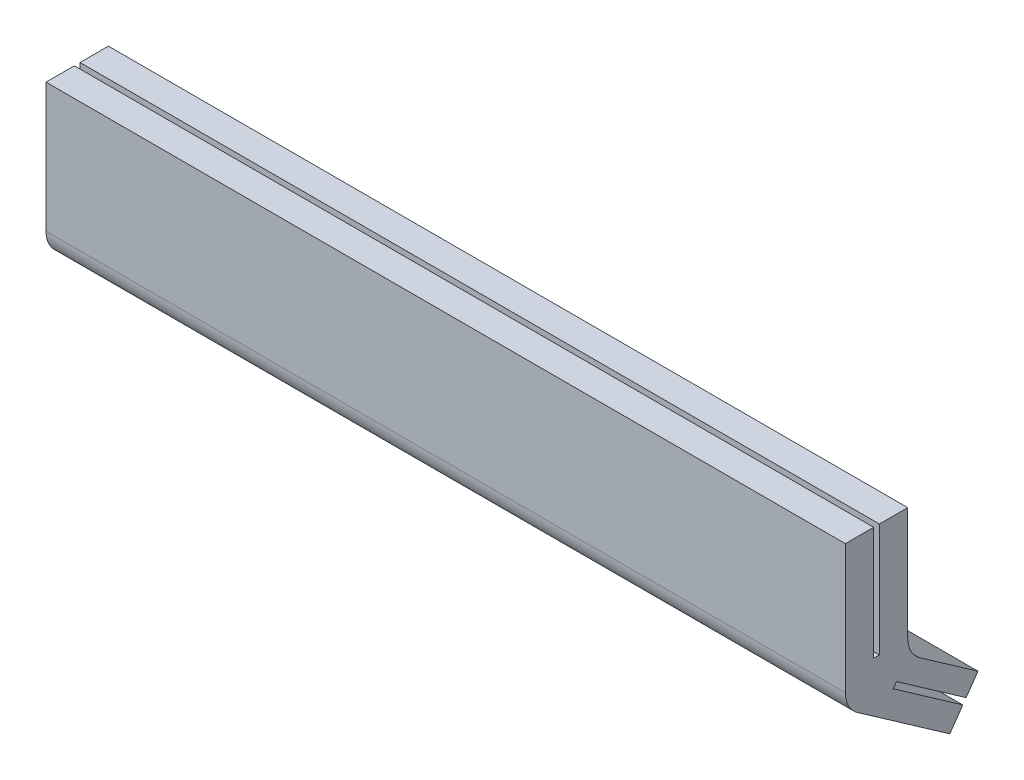
ISO-10303-21;
HEADER;
FILE_DESCRIPTION(('STEP AP214'),'2;1');
FILE_NAME('part.step','',(''),(''),'','','');
FILE_SCHEMA(('AUTOMOTIVE_DESIGN { 1 0 10303 214 1 1 1 1 }'));
ENDSEC;
DATA;
#1=APPLICATION_CONTEXT('core data for automotive mechanical design processes');
#2=APPLICATION_PROTOCOL_DEFINITION('international standard','automotive_design',2000,#1);
#3=PRODUCT_CONTEXT('',#1,'mechanical');
#4=PRODUCT('Part','Part','',(#3));
#5=PRODUCT_RELATED_PRODUCT_CATEGORY('part','',(#4));
#6=PRODUCT_DEFINITION_FORMATION('','',#4);
#7=PRODUCT_DEFINITION_CONTEXT('part definition',#1,'design');
#8=PRODUCT_DEFINITION('design','',#6,#7);
#9=PRODUCT_DEFINITION_SHAPE('','',#8);
#10=(LENGTH_UNIT() NAMED_UNIT(*) SI_UNIT(.MILLI.,.METRE.));
#11=(NAMED_UNIT(*) PLANE_ANGLE_UNIT() SI_UNIT($,.RADIAN.));
#12=(NAMED_UNIT(*) SI_UNIT($,.STERADIAN.) SOLID_ANGLE_UNIT());
#13=UNCERTAINTY_MEASURE_WITH_UNIT(LENGTH_MEASURE(1.E-05),#10,'distance_accuracy_value','');
#14=(GEOMETRIC_REPRESENTATION_CONTEXT(3) GLOBAL_UNCERTAINTY_ASSIGNED_CONTEXT((#13)) GLOBAL_UNIT_ASSIGNED_CONTEXT((#10,
#11,#12)) REPRESENTATION_CONTEXT('',''));
#15=CARTESIAN_POINT('',(0.,0.,0.));
#16=DIRECTION('',(0.,0.,1.));
#17=DIRECTION('',(1.,0.,0.));
#18=AXIS2_PLACEMENT_3D('',#15,#16,#17);
#19=CARTESIAN_POINT('',(280.71879766734,-285.,-12.0000000000006));
#20=DIRECTION('',(0.,-1.,0.));
#21=DIRECTION('',(0.,0.,-1.));
#22=AXIS2_PLACEMENT_3D('',#19,#20,#21);
#23=PLANE('',#22);
#24=DIRECTION('',(1.,0.,0.));
#25=VECTOR('',#24,1.);
#26=CARTESIAN_POINT('',(280.71879766734,-285.,-3.53883589099269E-13));
#27=LINE('',#26,#25);
#28=CARTESIAN_POINT('',(-141.,-285.,-4.037174620759E-13));
#29=VERTEX_POINT('',#28);
#30=CARTESIAN_POINT('',(141.,-285.,-3.53883593082689E-13));
#31=VERTEX_POINT('',#30);
#32=EDGE_CURVE('E159',#29,#31,#27,.T.);
#33=ORIENTED_EDGE('',*,*,#32,.F.);
#34=DIRECTION('',(0.,0.,1.));
#35=VECTOR('',#34,1.);
#36=CARTESIAN_POINT('',(-141.,-285.,-12.0000000000006));
#37=LINE('',#36,#35);
#38=CARTESIAN_POINT('',(-141.,-285.,9.99999999999945));
#39=VERTEX_POINT('',#38);
#40=EDGE_CURVE('E107',#29,#39,#37,.T.);
#41=ORIENTED_EDGE('',*,*,#40,.T.);
#42=DIRECTION('',(-1.,0.,0.));
#43=VECTOR('',#42,1.);
#44=CARTESIAN_POINT('',(280.71879766734,-285.,9.99999999999945));
#45=LINE('',#44,#43);
#46=CARTESIAN_POINT('',(141.,-285.,9.99999999999945));
#47=VERTEX_POINT('',#46);
#48=EDGE_CURVE('E255',#47,#39,#45,.T.);
#49=ORIENTED_EDGE('',*,*,#48,.F.);
#50=DIRECTION('',(0.,0.,1.));
#51=VECTOR('',#50,1.);
#52=CARTESIAN_POINT('',(141.,-285.,-12.0000000000006));
#53=LINE('',#52,#51);
#54=EDGE_CURVE('E221',#31,#47,#53,.T.);
#55=ORIENTED_EDGE('',*,*,#54,.F.);
#56=EDGE_LOOP('',(#33,#41,#49,#55));
#57=FACE_BOUND('',#56,.T.);
#58=ADVANCED_FACE('F32',(#57),#23,.F.);
#59=CARTESIAN_POINT('',(141.,-200.,0.));
#60=DIRECTION('',(1.,0.,0.));
#61=DIRECTION('',(0.,0.,-1.));
#62=AXIS2_PLACEMENT_3D('',#59,#60,#61);
#63=PLANE('',#62);
#64=DIRECTION('',(0.,1.,0.));
#65=VECTOR('',#64,1.);
#66=CARTESIAN_POINT('',(141.,-200.,-2.00000000000003));
#67=LINE('',#66,#65);
#68=CARTESIAN_POINT('',(141.,-325.,-2.00000000000056));
#69=VERTEX_POINT('',#68);
#70=CARTESIAN_POINT('',(141.,-285.,-2.00000000000036));
#71=VERTEX_POINT('',#70);
#72=EDGE_CURVE('E174',#69,#71,#67,.T.);
#73=ORIENTED_EDGE('',*,*,#72,.F.);
#74=DIRECTION('',(0.,0.,-1.));
#75=VECTOR('',#74,1.);
#76=CARTESIAN_POINT('',(141.,-325.,-4.73106403960405E-13));
#77=LINE('',#76,#75);
#78=CARTESIAN_POINT('',(141.,-325.,-5.55111513738092E-13));
#79=VERTEX_POINT('',#78);
#80=EDGE_CURVE('E162',#79,#69,#77,.T.);
#81=ORIENTED_EDGE('',*,*,#80,.F.);
#82=DIRECTION('',(0.,1.,0.));
#83=VECTOR('',#82,1.);
#84=CARTESIAN_POINT('',(141.,-200.,0.));
#85=LINE('',#84,#83);
#86=EDGE_CURVE('E157',#79,#31,#85,.T.);
#87=ORIENTED_EDGE('',*,*,#86,.T.);
#88=ORIENTED_EDGE('',*,*,#54,.T.);
#89=DIRECTION('',(0.,-1.,0.));
#90=VECTOR('',#89,1.);
#91=CARTESIAN_POINT('',(141.,-285.,9.99999999999945));
#92=LINE('',#91,#90);
#93=CARTESIAN_POINT('',(141.,-330.53179391148,9.99999999999946));
#94=VERTEX_POINT('',#93);
#95=EDGE_CURVE('E227',#47,#94,#92,.T.);
#96=ORIENTED_EDGE('',*,*,#95,.T.);
#97=CARTESIAN_POINT('',(141.,-330.53179391148,-5.51642065360625E-13));
#98=DIRECTION('',(1.,0.,0.));
#99=DIRECTION('',(0.,1.,0.));
#100=AXIS2_PLACEMENT_3D('',#97,#98,#99);
#101=CIRCLE('',#100,10.);
#102=CARTESIAN_POINT('',(141.,-338.72331435437,5.73576436350982));
#103=VERTEX_POINT('',#102);
#104=EDGE_CURVE('E230',#103,#94,#101,.F.);
#105=ORIENTED_EDGE('',*,*,#104,.F.);
#106=DIRECTION('',(0.,-0.57357643635104,-0.819152044288996));
#107=VECTOR('',#106,1.);
#108=CARTESIAN_POINT('',(141.,-338.72331435437,5.73576436350982));
#109=LINE('',#108,#107);
#110=CARTESIAN_POINT('',(141.,-361.548404052795,-26.8618419930054));
#111=VERTEX_POINT('',#110);
#112=EDGE_CURVE('E229',#103,#111,#109,.T.);
#113=ORIENTED_EDGE('',*,*,#112,.T.);
#114=DIRECTION('',(0.,0.819152044288982,-0.57357643635106));
#115=VECTOR('',#114,1.);
#116=CARTESIAN_POINT('',(141.,-361.548404052795,-26.8618419930054));
#117=LINE('',#116,#115);
#118=CARTESIAN_POINT('',(141.,-354.995187698483,-31.4504534838139));
#119=VERTEX_POINT('',#118);
#120=EDGE_CURVE('E236',#111,#119,#117,.T.);
#121=ORIENTED_EDGE('',*,*,#120,.T.);
#122=DIRECTION('',(0.,-0.573576436351041,-0.819152044288995));
#123=VECTOR('',#122,1.);
#124=CARTESIAN_POINT('',(141.,-337.787894607952,-6.87589215514395));
#125=LINE('',#124,#123);
#126=CARTESIAN_POINT('',(141.,-337.787894607952,-6.87589215514397));
#127=VERTEX_POINT('',#126);
#128=EDGE_CURVE('E238',#127,#119,#125,.T.);
#129=ORIENTED_EDGE('',*,*,#128,.F.);
#130=DIRECTION('',(0.,-0.819152044288973,0.573576436351073));
#131=VECTOR('',#130,1.);
#132=CARTESIAN_POINT('',(141.,-336.149590519374,-8.0230450278461));
#133=LINE('',#132,#131);
#134=CARTESIAN_POINT('',(141.,-336.149590519374,-8.02304502784611));
#135=VERTEX_POINT('',#134);
#136=EDGE_CURVE('E243',#135,#127,#133,.T.);
#137=ORIENTED_EDGE('',*,*,#136,.F.);
#138=DIRECTION('',(0.,0.57357643635104,0.819152044288996));
#139=VECTOR('',#138,1.);
#140=CARTESIAN_POINT('',(141.,-353.356883609905,-32.5976063565159));
#141=LINE('',#140,#139);
#142=CARTESIAN_POINT('',(141.,-353.356883609905,-32.5976063565159));
#143=VERTEX_POINT('',#142);
#144=EDGE_CURVE('E247',#143,#135,#141,.T.);
#145=ORIENTED_EDGE('',*,*,#144,.F.);
#146=DIRECTION('',(0.,0.819152044288995,-0.573576436351042));
#147=VECTOR('',#146,1.);
#148=CARTESIAN_POINT('',(141.,-353.356883609905,-32.5976063565159));
#149=LINE('',#148,#147);
#150=CARTESIAN_POINT('',(141.,-347.361888814537,-36.7953469037603));
#151=VERTEX_POINT('',#150);
#152=EDGE_CURVE('E56',#143,#151,#149,.T.);
#153=ORIENTED_EDGE('',*,*,#152,.T.);
#154=DIRECTION('',(0.,-0.57357643635104,-0.819152044288996));
#155=VECTOR('',#154,1.);
#156=CARTESIAN_POINT('',(141.,-332.985849937373,-16.2642356364903));
#157=LINE('',#156,#155);
#158=CARTESIAN_POINT('',(141.,-332.985849937373,-16.2642356364903));
#159=VERTEX_POINT('',#158);
#160=EDGE_CURVE('E91',#159,#151,#157,.T.);
#161=ORIENTED_EDGE('',*,*,#160,.F.);
#162=CARTESIAN_POINT('',(141.,-324.794329494483,-22.0000000000006));
#163=DIRECTION('',(1.,0.,0.));
#164=DIRECTION('',(0.,1.,0.));
#165=AXIS2_PLACEMENT_3D('',#162,#163,#164);
#166=CIRCLE('',#165,9.99999999999995);
#167=CARTESIAN_POINT('',(141.,-324.794329494482,-12.0000000000006));
#168=VERTEX_POINT('',#167);
#169=EDGE_CURVE('E217',#159,#168,#166,.F.);
#170=ORIENTED_EDGE('',*,*,#169,.T.);
#171=DIRECTION('',(0.,-1.,0.));
#172=VECTOR('',#171,1.);
#173=CARTESIAN_POINT('',(141.,-285.,-12.0000000000006));
#174=LINE('',#173,#172);
#175=CARTESIAN_POINT('',(141.,-285.,-12.0000000000006));
#176=VERTEX_POINT('',#175);
#177=EDGE_CURVE('E222',#176,#168,#174,.T.);
#178=ORIENTED_EDGE('',*,*,#177,.F.);
#179=EDGE_CURVE('E225',#176,#71,#53,.T.);
#180=ORIENTED_EDGE('',*,*,#179,.T.);
#181=EDGE_LOOP('',(#73,#81,#87,#88,#96,#105,#113,#121,#129,#137,#145,#153,#161,#170,#178,#180));
#182=FACE_BOUND('',#181,.T.);
#183=ADVANCED_FACE('F34',(#182),#63,.T.);
#184=CARTESIAN_POINT('',(280.71879766734,-332.985849937373,-16.2642356364903));
#185=DIRECTION('',(0.,0.819152044288996,-0.57357643635104));
#186=DIRECTION('',(0.,0.57357643635104,0.819152044288996));
#187=AXIS2_PLACEMENT_3D('',#184,#185,#186);
#188=PLANE('',#187);
#189=DIRECTION('',(-1.,0.,0.));
#190=VECTOR('',#189,1.);
#191=CARTESIAN_POINT('',(280.71879766734,-332.985849937373,-16.2642356364903));
#192=LINE('',#191,#190);
#193=CARTESIAN_POINT('',(-141.,-332.985849937373,-16.2642356364903));
#194=VERTEX_POINT('',#193);
#195=EDGE_CURVE('E253',#159,#194,#192,.T.);
#196=ORIENTED_EDGE('',*,*,#195,.F.);
#197=ORIENTED_EDGE('',*,*,#160,.T.);
#198=DIRECTION('',(-1.,0.,0.));
#199=VECTOR('',#198,1.);
#200=CARTESIAN_POINT('',(280.71879766734,-347.361888814537,-36.7953469037603));
#201=LINE('',#200,#199);
#202=CARTESIAN_POINT('',(-141.,-347.361888814537,-36.7953469037603));
#203=VERTEX_POINT('',#202);
#204=EDGE_CURVE('E219',#151,#203,#201,.T.);
#205=ORIENTED_EDGE('',*,*,#204,.T.);
#206=DIRECTION('',(0.,-0.57357643635104,-0.819152044288996));
#207=VECTOR('',#206,1.);
#208=CARTESIAN_POINT('',(-141.,-332.985849937373,-16.2642356364903));
#209=LINE('',#208,#207);
#210=EDGE_CURVE('E186',#194,#203,#209,.T.);
#211=ORIENTED_EDGE('',*,*,#210,.F.);
#212=EDGE_LOOP('',(#196,#197,#205,#211));
#213=FACE_BOUND('',#212,.T.);
#214=ADVANCED_FACE('F288',(#213),#188,.T.);
#215=CARTESIAN_POINT('',(280.71879766734,-353.356883609905,-32.5976063565159));
#216=DIRECTION('',(0.,0.573576436351042,0.819152044288995));
#217=DIRECTION('',(0.,-0.819152044288995,0.573576436351042));
#218=AXIS2_PLACEMENT_3D('',#215,#216,#217);
#219=PLANE('',#218);
#220=ORIENTED_EDGE('',*,*,#152,.F.);
#221=DIRECTION('',(-1.,0.,0.));
#222=VECTOR('',#221,1.);
#223=CARTESIAN_POINT('',(280.71879766734,-353.356883609905,-32.5976063565159));
#224=LINE('',#223,#222);
#225=CARTESIAN_POINT('',(-141.,-353.356883609905,-32.5976063565159));
#226=VERTEX_POINT('',#225);
#227=EDGE_CURVE('E250',#143,#226,#224,.T.);
#228=ORIENTED_EDGE('',*,*,#227,.T.);
#229=DIRECTION('',(0.,0.819152044288995,-0.573576436351042));
#230=VECTOR('',#229,1.);
#231=CARTESIAN_POINT('',(-141.,-353.356883609905,-32.5976063565159));
#232=LINE('',#231,#230);
#233=EDGE_CURVE('E201',#226,#203,#232,.T.);
#234=ORIENTED_EDGE('',*,*,#233,.T.);
#235=ORIENTED_EDGE('',*,*,#204,.F.);
#236=EDGE_LOOP('',(#220,#228,#234,#235));
#237=FACE_BOUND('',#236,.T.);
#238=ADVANCED_FACE('F290',(#237),#219,.F.);
#239=CARTESIAN_POINT('',(280.71879766734,-353.356883609905,-32.5976063565159));
#240=DIRECTION('',(0.,-0.819152044288996,0.57357643635104));
#241=DIRECTION('',(0.,-0.57357643635104,-0.819152044288996));
#242=AXIS2_PLACEMENT_3D('',#239,#240,#241);
#243=PLANE('',#242);
#244=ORIENTED_EDGE('',*,*,#227,.F.);
#245=ORIENTED_EDGE('',*,*,#144,.T.);
#246=DIRECTION('',(-1.,0.,0.));
#247=VECTOR('',#246,1.);
#248=CARTESIAN_POINT('',(280.71879766734,-336.149590519374,-8.0230450278461));
#249=LINE('',#248,#247);
#250=CARTESIAN_POINT('',(-141.,-336.149590519374,-8.0230450278461));
#251=VERTEX_POINT('',#250);
#252=EDGE_CURVE('E246',#135,#251,#249,.T.);
#253=ORIENTED_EDGE('',*,*,#252,.T.);
#254=DIRECTION('',(0.,0.57357643635104,0.819152044288996));
#255=VECTOR('',#254,1.);
#256=CARTESIAN_POINT('',(-141.,-353.356883609905,-32.5976063565159));
#257=LINE('',#256,#255);
#258=EDGE_CURVE('E207',#226,#251,#257,.T.);
#259=ORIENTED_EDGE('',*,*,#258,.F.);
#260=EDGE_LOOP('',(#244,#245,#253,#259));
#261=FACE_BOUND('',#260,.T.);
#262=ADVANCED_FACE('F295',(#261),#243,.T.);
#263=CARTESIAN_POINT('',(280.71879766734,-336.149590519374,-8.0230450278461));
#264=DIRECTION('',(0.,-0.573576436351073,-0.819152044288973));
#265=DIRECTION('',(0.,0.819152044288973,-0.573576436351073));
#266=AXIS2_PLACEMENT_3D('',#263,#264,#265);
#267=PLANE('',#266);
#268=ORIENTED_EDGE('',*,*,#252,.F.);
#269=ORIENTED_EDGE('',*,*,#136,.T.);
#270=DIRECTION('',(-1.,0.,0.));
#271=VECTOR('',#270,1.);
#272=CARTESIAN_POINT('',(280.71879766734,-337.787894607952,-6.87589215514395));
#273=LINE('',#272,#271);
#274=CARTESIAN_POINT('',(-141.,-337.787894607952,-6.87589215514395));
#275=VERTEX_POINT('',#274);
#276=EDGE_CURVE('E242',#127,#275,#273,.T.);
#277=ORIENTED_EDGE('',*,*,#276,.T.);
#278=DIRECTION('',(0.,-0.819152044288973,0.573576436351073));
#279=VECTOR('',#278,1.);
#280=CARTESIAN_POINT('',(-141.,-336.149590519374,-8.02304502784611));
#281=LINE('',#280,#279);
#282=EDGE_CURVE('E204',#251,#275,#281,.T.);
#283=ORIENTED_EDGE('',*,*,#282,.F.);
#284=EDGE_LOOP('',(#268,#269,#277,#283));
#285=FACE_BOUND('',#284,.T.);
#286=ADVANCED_FACE('F298',(#285),#267,.T.);
#287=CARTESIAN_POINT('',(280.71879766734,-337.787894607952,-6.87589215514395));
#288=DIRECTION('',(0.,0.819152044288995,-0.573576436351041));
#289=DIRECTION('',(0.,0.573576436351041,0.819152044288995));
#290=AXIS2_PLACEMENT_3D('',#287,#288,#289);
#291=PLANE('',#290);
#292=ORIENTED_EDGE('',*,*,#276,.F.);
#293=ORIENTED_EDGE('',*,*,#128,.T.);
#294=DIRECTION('',(-1.,0.,0.));
#295=VECTOR('',#294,1.);
#296=CARTESIAN_POINT('',(280.71879766734,-354.995187698483,-31.4504534838139));
#297=LINE('',#296,#295);
#298=CARTESIAN_POINT('',(-141.,-354.995187698483,-31.4504534838139));
#299=VERTEX_POINT('',#298);
#300=EDGE_CURVE('E241',#119,#299,#297,.T.);
#301=ORIENTED_EDGE('',*,*,#300,.T.);
#302=DIRECTION('',(0.,-0.573576436351041,-0.819152044288995));
#303=VECTOR('',#302,1.);
#304=CARTESIAN_POINT('',(-141.,-337.787894607952,-6.87589215514395));
#305=LINE('',#304,#303);
#306=EDGE_CURVE('E195',#275,#299,#305,.T.);
#307=ORIENTED_EDGE('',*,*,#306,.F.);
#308=EDGE_LOOP('',(#292,#293,#301,#307));
#309=FACE_BOUND('',#308,.T.);
#310=ADVANCED_FACE('F302',(#309),#291,.T.);
#311=CARTESIAN_POINT('',(280.71879766734,-361.548404052795,-26.8618419930054));
#312=DIRECTION('',(0.,0.57357643635106,0.819152044288982));
#313=DIRECTION('',(0.,-0.819152044288982,0.57357643635106));
#314=AXIS2_PLACEMENT_3D('',#311,#312,#313);
#315=PLANE('',#314);
#316=ORIENTED_EDGE('',*,*,#120,.F.);
#317=DIRECTION('',(-1.,0.,0.));
#318=VECTOR('',#317,1.);
#319=CARTESIAN_POINT('',(280.71879766734,-361.548404052795,-26.8618419930054));
#320=LINE('',#319,#318);
#321=CARTESIAN_POINT('',(-141.,-361.548404052795,-26.8618419930054));
#322=VERTEX_POINT('',#321);
#323=EDGE_CURVE('E259',#111,#322,#320,.T.);
#324=ORIENTED_EDGE('',*,*,#323,.T.);
#325=DIRECTION('',(0.,0.819152044288982,-0.57357643635106));
#326=VECTOR('',#325,1.);
#327=CARTESIAN_POINT('',(-141.,-361.548404052795,-26.8618419930054));
#328=LINE('',#327,#326);
#329=EDGE_CURVE('E198',#322,#299,#328,.T.);
#330=ORIENTED_EDGE('',*,*,#329,.T.);
#331=ORIENTED_EDGE('',*,*,#300,.F.);
#332=EDGE_LOOP('',(#316,#324,#330,#331));
#333=FACE_BOUND('',#332,.T.);
#334=ADVANCED_FACE('F308',(#333),#315,.F.);
#335=CARTESIAN_POINT('',(280.71879766734,-338.72331435437,5.73576436350982));
#336=DIRECTION('',(0.,0.819152044288996,-0.57357643635104));
#337=DIRECTION('',(0.,0.57357643635104,0.819152044288996));
#338=AXIS2_PLACEMENT_3D('',#335,#336,#337);
#339=PLANE('',#338);
#340=ORIENTED_EDGE('',*,*,#112,.F.);
#341=DIRECTION('',(-1.,0.,0.));
#342=VECTOR('',#341,1.);
#343=CARTESIAN_POINT('',(280.71879766734,-338.72331435437,5.73576436350982));
#344=LINE('',#343,#342);
#345=CARTESIAN_POINT('',(-141.,-338.72331435437,5.73576436350982));
#346=VERTEX_POINT('',#345);
#347=EDGE_CURVE('E234',#103,#346,#344,.T.);
#348=ORIENTED_EDGE('',*,*,#347,.T.);
#349=DIRECTION('',(0.,-0.57357643635104,-0.819152044288996));
#350=VECTOR('',#349,1.);
#351=CARTESIAN_POINT('',(-141.,-338.72331435437,5.73576436350982));
#352=LINE('',#351,#350);
#353=EDGE_CURVE('E190',#346,#322,#352,.T.);
#354=ORIENTED_EDGE('',*,*,#353,.T.);
#355=ORIENTED_EDGE('',*,*,#323,.F.);
#356=EDGE_LOOP('',(#340,#348,#354,#355));
#357=FACE_BOUND('',#356,.T.);
#358=ADVANCED_FACE('F312',(#357),#339,.F.);
#359=CARTESIAN_POINT('',(280.71879766734,-330.53179391148,-5.51642065360625E-13));
#360=DIRECTION('',(-1.,0.,0.));
#361=DIRECTION('',(0.,0.,1.));
#362=AXIS2_PLACEMENT_3D('',#359,#360,#361);
#363=CYLINDRICAL_SURFACE('',#362,10.);
#364=ORIENTED_EDGE('',*,*,#347,.F.);
#365=ORIENTED_EDGE('',*,*,#104,.T.);
#366=DIRECTION('',(-1.,0.,0.));
#367=VECTOR('',#366,1.);
#368=CARTESIAN_POINT('',(280.71879766734,-330.53179391148,9.99999999999946));
#369=LINE('',#368,#367);
#370=CARTESIAN_POINT('',(-141.,-330.53179391148,9.99999999999946));
#371=VERTEX_POINT('',#370);
#372=EDGE_CURVE('E233',#94,#371,#369,.T.);
#373=ORIENTED_EDGE('',*,*,#372,.T.);
#374=CARTESIAN_POINT('',(-141.,-330.53179391148,-5.51642065360625E-13));
#375=DIRECTION('',(-1.,0.,0.));
#376=DIRECTION('',(0.,-1.,0.));
#377=AXIS2_PLACEMENT_3D('',#374,#375,#376);
#378=CIRCLE('',#377,10.);
#379=EDGE_CURVE('E191',#346,#371,#378,.T.);
#380=ORIENTED_EDGE('',*,*,#379,.F.);
#381=EDGE_LOOP('',(#364,#365,#373,#380));
#382=FACE_BOUND('',#381,.T.);
#383=ADVANCED_FACE('F316',(#382),#363,.T.);
#384=CARTESIAN_POINT('',(280.71879766734,-285.,9.99999999999945));
#385=DIRECTION('',(0.,0.,-1.));
#386=DIRECTION('',(0.,1.,0.));
#387=AXIS2_PLACEMENT_3D('',#384,#385,#386);
#388=PLANE('',#387);
#389=ORIENTED_EDGE('',*,*,#95,.F.);
#390=ORIENTED_EDGE('',*,*,#48,.T.);
#391=DIRECTION('',(0.,-1.,0.));
#392=VECTOR('',#391,1.);
#393=CARTESIAN_POINT('',(-141.,-285.,9.99999999999945));
#394=LINE('',#393,#392);
#395=EDGE_CURVE('E187',#39,#371,#394,.T.);
#396=ORIENTED_EDGE('',*,*,#395,.T.);
#397=ORIENTED_EDGE('',*,*,#372,.F.);
#398=EDGE_LOOP('',(#389,#390,#396,#397));
#399=FACE_BOUND('',#398,.T.);
#400=ADVANCED_FACE('F320',(#399),#388,.F.);
#401=CARTESIAN_POINT('',(-141.,-285.,-12.0000000000006));
#402=VERTEX_POINT('',#401);
#403=CARTESIAN_POINT('',(-141.,-285.,-2.00000000000036));
#404=VERTEX_POINT('',#403);
#405=EDGE_CURVE('E183',#402,#404,#37,.T.);
#406=ORIENTED_EDGE('',*,*,#405,.T.);
#407=DIRECTION('',(1.,0.,0.));
#408=VECTOR('',#407,1.);
#409=CARTESIAN_POINT('',(280.71879766734,-285.,-2.00000000000036));
#410=LINE('',#409,#408);
#411=EDGE_CURVE('E175',#404,#71,#410,.T.);
#412=ORIENTED_EDGE('',*,*,#411,.T.);
#413=ORIENTED_EDGE('',*,*,#179,.F.);
#414=DIRECTION('',(-1.,0.,0.));
#415=VECTOR('',#414,1.);
#416=CARTESIAN_POINT('',(280.71879766734,-285.,-12.0000000000006));
#417=LINE('',#416,#415);
#418=EDGE_CURVE('E224',#176,#402,#417,.T.);
#419=ORIENTED_EDGE('',*,*,#418,.T.);
#420=EDGE_LOOP('',(#406,#412,#413,#419));
#421=FACE_BOUND('',#420,.T.);
#422=ADVANCED_FACE('F277',(#421),#23,.F.);
#423=CARTESIAN_POINT('',(280.71879766734,-285.,-12.0000000000006));
#424=DIRECTION('',(0.,0.,-1.));
#425=DIRECTION('',(0.,1.,0.));
#426=AXIS2_PLACEMENT_3D('',#423,#424,#425);
#427=PLANE('',#426);
#428=ORIENTED_EDGE('',*,*,#418,.F.);
#429=ORIENTED_EDGE('',*,*,#177,.T.);
#430=DIRECTION('',(-1.,0.,0.));
#431=VECTOR('',#430,1.);
#432=CARTESIAN_POINT('',(280.71879766734,-324.794329494483,-12.0000000000006));
#433=LINE('',#432,#431);
#434=CARTESIAN_POINT('',(-141.,-324.794329494482,-12.0000000000006));
#435=VERTEX_POINT('',#434);
#436=EDGE_CURVE('E99',#168,#435,#433,.T.);
#437=ORIENTED_EDGE('',*,*,#436,.T.);
#438=DIRECTION('',(0.,-1.,0.));
#439=VECTOR('',#438,1.);
#440=CARTESIAN_POINT('',(-141.,-285.,-12.0000000000006));
#441=LINE('',#440,#439);
#442=EDGE_CURVE('E194',#402,#435,#441,.T.);
#443=ORIENTED_EDGE('',*,*,#442,.F.);
#444=EDGE_LOOP('',(#428,#429,#437,#443));
#445=FACE_BOUND('',#444,.T.);
#446=ADVANCED_FACE('F280',(#445),#427,.T.);
#447=CARTESIAN_POINT('',(280.71879766734,-324.794329494483,-22.0000000000006));
#448=DIRECTION('',(-1.,0.,0.));
#449=DIRECTION('',(0.,0.,1.));
#450=AXIS2_PLACEMENT_3D('',#447,#448,#449);
#451=CYLINDRICAL_SURFACE('',#450,9.99999999999995);
#452=ORIENTED_EDGE('',*,*,#169,.F.);
#453=ORIENTED_EDGE('',*,*,#195,.T.);
#454=CARTESIAN_POINT('',(-141.,-324.794329494483,-22.0000000000006));
#455=DIRECTION('',(-1.,0.,0.));
#456=DIRECTION('',(0.,-1.,0.));
#457=AXIS2_PLACEMENT_3D('',#454,#455,#456);
#458=CIRCLE('',#457,9.99999999999995);
#459=EDGE_CURVE('E182',#194,#435,#458,.T.);
#460=ORIENTED_EDGE('',*,*,#459,.T.);
#461=ORIENTED_EDGE('',*,*,#436,.F.);
#462=EDGE_LOOP('',(#452,#453,#460,#461));
#463=FACE_BOUND('',#462,.T.);
#464=ADVANCED_FACE('F285',(#463),#451,.F.);
#465=CARTESIAN_POINT('',(-141.,-325.,-5.55111510887065E-13));
#466=DIRECTION('',(-1.,0.,0.));
#467=DIRECTION('',(0.,0.,1.));
#468=AXIS2_PLACEMENT_3D('',#465,#466,#467);
#469=PLANE('',#468);
#470=DIRECTION('',(0.,-1.,0.));
#471=VECTOR('',#470,1.);
#472=CARTESIAN_POINT('',(-141.,-325.,-2.00000000000051));
#473=LINE('',#472,#471);
#474=CARTESIAN_POINT('',(-141.,-325.,-2.00000000000056));
#475=VERTEX_POINT('',#474);
#476=EDGE_CURVE('E11',#404,#475,#473,.T.);
#477=ORIENTED_EDGE('',*,*,#476,.F.);
#478=ORIENTED_EDGE('',*,*,#405,.F.);
#479=ORIENTED_EDGE('',*,*,#442,.T.);
#480=ORIENTED_EDGE('',*,*,#459,.F.);
#481=ORIENTED_EDGE('',*,*,#210,.T.);
#482=ORIENTED_EDGE('',*,*,#233,.F.);
#483=ORIENTED_EDGE('',*,*,#258,.T.);
#484=ORIENTED_EDGE('',*,*,#282,.T.);
#485=ORIENTED_EDGE('',*,*,#306,.T.);
#486=ORIENTED_EDGE('',*,*,#329,.F.);
#487=ORIENTED_EDGE('',*,*,#353,.F.);
#488=ORIENTED_EDGE('',*,*,#379,.T.);
#489=ORIENTED_EDGE('',*,*,#395,.F.);
#490=ORIENTED_EDGE('',*,*,#40,.F.);
#491=DIRECTION('',(0.,-1.,0.));
#492=VECTOR('',#491,1.);
#493=CARTESIAN_POINT('',(-141.,-325.,-5.55111510887065E-13));
#494=LINE('',#493,#492);
#495=CARTESIAN_POINT('',(-141.,-325.,-5.55111510887065E-13));
#496=VERTEX_POINT('',#495);
#497=EDGE_CURVE('E267',#29,#496,#494,.T.);
#498=ORIENTED_EDGE('',*,*,#497,.T.);
#499=DIRECTION('',(0.,0.,1.));
#500=VECTOR('',#499,1.);
#501=CARTESIAN_POINT('',(-141.,-325.,-5.55111510887065E-13));
#502=LINE('',#501,#500);
#503=EDGE_CURVE('E40',#475,#496,#502,.T.);
#504=ORIENTED_EDGE('',*,*,#503,.F.);
#505=EDGE_LOOP('',(#477,#478,#479,#480,#481,#482,#483,#484,#485,#486,#487,#488,#489,#490,#498,#504));
#506=FACE_BOUND('',#505,.T.);
#507=ADVANCED_FACE('F270',(#506),#469,.T.);
#508=CARTESIAN_POINT('',(-191.,-250.,-2.00000000000022));
#509=DIRECTION('',(0.,0.,-1.));
#510=DIRECTION('',(-1.,0.,0.));
#511=AXIS2_PLACEMENT_3D('',#508,#509,#510);
#512=PLANE('',#511);
#513=ORIENTED_EDGE('',*,*,#72,.T.);
#514=ORIENTED_EDGE('',*,*,#411,.F.);
#515=ORIENTED_EDGE('',*,*,#476,.T.);
#516=DIRECTION('',(-1.,0.,0.));
#517=VECTOR('',#516,1.);
#518=CARTESIAN_POINT('',(191.,-325.,-2.00000000000056));
#519=LINE('',#518,#517);
#520=EDGE_CURVE('E170',#69,#475,#519,.T.);
#521=ORIENTED_EDGE('',*,*,#520,.F.);
#522=EDGE_LOOP('',(#513,#514,#515,#521));
#523=FACE_BOUND('',#522,.T.);
#524=ADVANCED_FACE('F274',(#523),#512,.F.);
#525=CARTESIAN_POINT('',(191.,-325.,-5.55111512312578E-13));
#526=DIRECTION('',(0.,-1.,0.));
#527=DIRECTION('',(1.,0.,0.));
#528=AXIS2_PLACEMENT_3D('',#525,#526,#527);
#529=PLANE('',#528);
#530=ORIENTED_EDGE('',*,*,#80,.T.);
#531=ORIENTED_EDGE('',*,*,#520,.T.);
#532=ORIENTED_EDGE('',*,*,#503,.T.);
#533=DIRECTION('',(-1.,0.,0.));
#534=VECTOR('',#533,1.);
#535=CARTESIAN_POINT('',(191.,-325.,-5.55111512312578E-13));
#536=LINE('',#535,#534);
#537=EDGE_CURVE('E47',#79,#496,#536,.T.);
#538=ORIENTED_EDGE('',*,*,#537,.F.);
#539=EDGE_LOOP('',(#530,#531,#532,#538));
#540=FACE_BOUND('',#539,.T.);
#541=ADVANCED_FACE('F165',(#540),#529,.F.);
#542=CARTESIAN_POINT('',(-191.,-250.,-2.22044604925031E-13));
#543=DIRECTION('',(0.,0.,-1.));
#544=DIRECTION('',(-1.,0.,0.));
#545=AXIS2_PLACEMENT_3D('',#542,#543,#544);
#546=PLANE('',#545);
#547=ORIENTED_EDGE('',*,*,#537,.T.);
#548=ORIENTED_EDGE('',*,*,#497,.F.);
#549=ORIENTED_EDGE('',*,*,#32,.T.);
#550=ORIENTED_EDGE('',*,*,#86,.F.);
#551=EDGE_LOOP('',(#547,#548,#549,#550));
#552=FACE_BOUND('',#551,.T.);
#553=ADVANCED_FACE('F158',(#552),#546,.T.);
#554=CLOSED_SHELL('',(#58,#183,#214,#238,#262,#286,#310,#334,#358,#383,#400,#422,#446,#464,#507,
#524,#541,#553));
#555=MANIFOLD_SOLID_BREP('B2',#554);
#556=ADVANCED_BREP_SHAPE_REPRESENTATION('',(#18,#555),#14);
#557=SHAPE_DEFINITION_REPRESENTATION(#9,#556);
ENDSEC;
END-ISO-10303-21;
